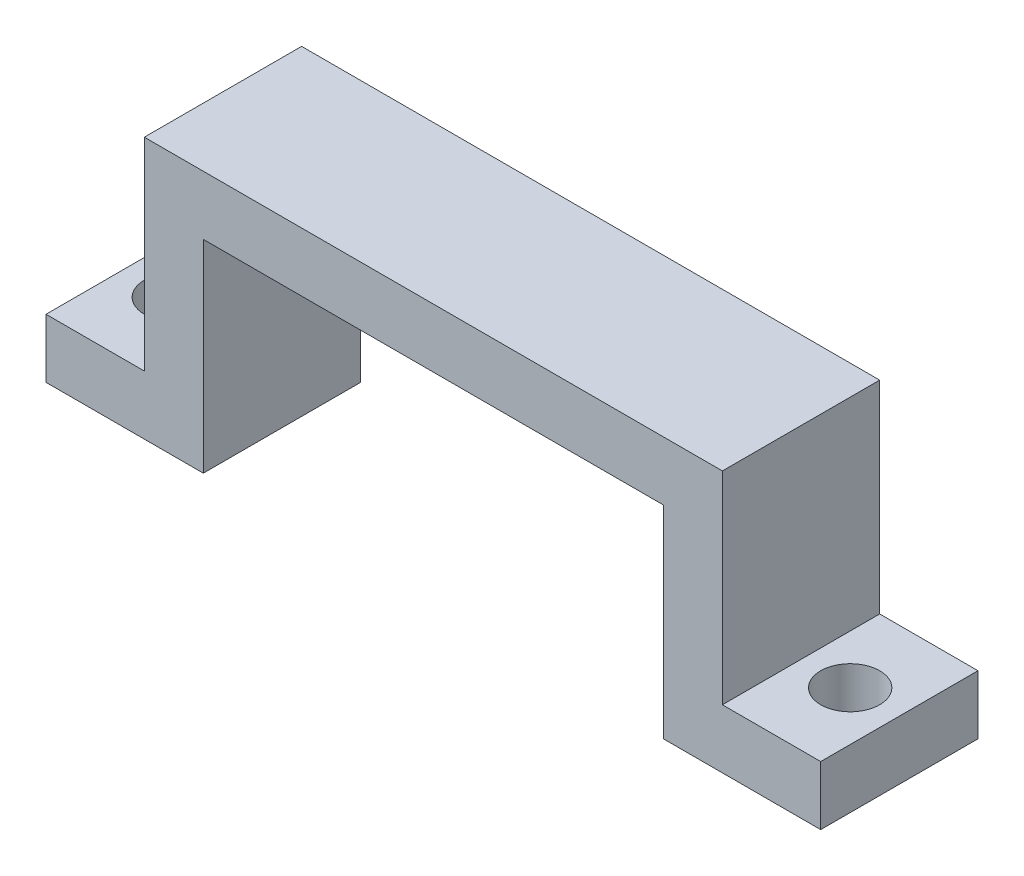
ISO-10303-21;
HEADER;
FILE_DESCRIPTION(('STEP AP214'),'2;1');
FILE_NAME('part.step','',(''),(''),'','','');
FILE_SCHEMA(('AUTOMOTIVE_DESIGN { 1 0 10303 214 1 1 1 1 }'));
ENDSEC;
DATA;
#1=APPLICATION_CONTEXT('core data for automotive mechanical design processes');
#2=APPLICATION_PROTOCOL_DEFINITION('international standard','automotive_design',2000,#1);
#3=PRODUCT_CONTEXT('',#1,'mechanical');
#4=PRODUCT('Part','Part','',(#3));
#5=PRODUCT_RELATED_PRODUCT_CATEGORY('part','',(#4));
#6=PRODUCT_DEFINITION_FORMATION('','',#4);
#7=PRODUCT_DEFINITION_CONTEXT('part definition',#1,'design');
#8=PRODUCT_DEFINITION('design','',#6,#7);
#9=PRODUCT_DEFINITION_SHAPE('','',#8);
#10=(LENGTH_UNIT() NAMED_UNIT(*) SI_UNIT(.MILLI.,.METRE.));
#11=(NAMED_UNIT(*) PLANE_ANGLE_UNIT() SI_UNIT($,.RADIAN.));
#12=(NAMED_UNIT(*) SI_UNIT($,.STERADIAN.) SOLID_ANGLE_UNIT());
#13=UNCERTAINTY_MEASURE_WITH_UNIT(LENGTH_MEASURE(1.E-05),#10,'distance_accuracy_value','');
#14=(GEOMETRIC_REPRESENTATION_CONTEXT(3) GLOBAL_UNCERTAINTY_ASSIGNED_CONTEXT((#13)) GLOBAL_UNIT_ASSIGNED_CONTEXT((#10,
#11,#12)) REPRESENTATION_CONTEXT('',''));
#15=CARTESIAN_POINT('',(0.,0.,0.));
#16=DIRECTION('',(0.,0.,1.));
#17=DIRECTION('',(1.,0.,0.));
#18=AXIS2_PLACEMENT_3D('',#15,#16,#17);
#19=CARTESIAN_POINT('',(-14.7,-13.3,-4.));
#20=DIRECTION('',(-1.,0.,0.));
#21=DIRECTION('',(0.,0.,1.));
#22=AXIS2_PLACEMENT_3D('',#19,#20,#21);
#23=PLANE('',#22);
#24=DIRECTION('',(0.,1.,0.));
#25=VECTOR('',#24,1.);
#26=CARTESIAN_POINT('',(-14.7,-13.3,-4.));
#27=LINE('',#26,#25);
#28=CARTESIAN_POINT('',(-14.7,-10.3,-4.));
#29=VERTEX_POINT('',#28);
#30=CARTESIAN_POINT('',(-14.7,0.,-4.));
#31=VERTEX_POINT('',#30);
#32=EDGE_CURVE('E223',#29,#31,#27,.T.);
#33=ORIENTED_EDGE('',*,*,#32,.F.);
#34=DIRECTION('',(0.,0.,1.));
#35=VECTOR('',#34,1.);
#36=CARTESIAN_POINT('',(-14.7,-10.3,4.));
#37=LINE('',#36,#35);
#38=CARTESIAN_POINT('',(-14.7,-10.3,4.));
#39=VERTEX_POINT('',#38);
#40=EDGE_CURVE('E144',#29,#39,#37,.T.);
#41=ORIENTED_EDGE('',*,*,#40,.T.);
#42=DIRECTION('',(0.,1.,0.));
#43=VECTOR('',#42,1.);
#44=CARTESIAN_POINT('',(-14.7,-13.3,4.));
#45=LINE('',#44,#43);
#46=CARTESIAN_POINT('',(-14.7,0.,4.));
#47=VERTEX_POINT('',#46);
#48=EDGE_CURVE('E44',#39,#47,#45,.T.);
#49=ORIENTED_EDGE('',*,*,#48,.T.);
#50=DIRECTION('',(0.,0.,1.));
#51=VECTOR('',#50,1.);
#52=CARTESIAN_POINT('',(-14.7,0.,-4.));
#53=LINE('',#52,#51);
#54=EDGE_CURVE('E217',#31,#47,#53,.T.);
#55=ORIENTED_EDGE('',*,*,#54,.F.);
#56=EDGE_LOOP('',(#33,#41,#49,#55));
#57=FACE_BOUND('',#56,.T.);
#58=ADVANCED_FACE('F35',(#57),#23,.T.);
#59=CARTESIAN_POINT('',(0.,-13.3,0.));
#60=DIRECTION('',(0.,1.,0.));
#61=DIRECTION('',(0.,0.,1.));
#62=AXIS2_PLACEMENT_3D('',#59,#60,#61);
#63=PLANE('',#62);
#64=CARTESIAN_POINT('',(-17.2,-13.3,0.));
#65=DIRECTION('',(0.,1.,0.));
#66=DIRECTION('',(0.,0.,1.));
#67=AXIS2_PLACEMENT_3D('',#64,#65,#66);
#68=CIRCLE('',#67,1.5);
#69=CARTESIAN_POINT('',(-17.2,-13.3,1.5));
#70=VERTEX_POINT('',#69);
#71=EDGE_CURVE('E422',#70,#70,#68,.T.);
#72=ORIENTED_EDGE('',*,*,#71,.T.);
#73=EDGE_LOOP('',(#72));
#74=FACE_BOUND('',#73,.T.);
#75=DIRECTION('',(-1.,0.,0.));
#76=VECTOR('',#75,1.);
#77=CARTESIAN_POINT('',(-14.7,-13.3,-4.));
#78=LINE('',#77,#76);
#79=CARTESIAN_POINT('',(-11.7,-13.3,-4.));
#80=VERTEX_POINT('',#79);
#81=CARTESIAN_POINT('',(-19.7,-13.3,-4.));
#82=VERTEX_POINT('',#81);
#83=EDGE_CURVE('E209',#80,#82,#78,.T.);
#84=ORIENTED_EDGE('',*,*,#83,.F.);
#85=DIRECTION('',(0.,0.,1.));
#86=VECTOR('',#85,1.);
#87=CARTESIAN_POINT('',(-11.7,-13.3,-4.001));
#88=LINE('',#87,#86);
#89=CARTESIAN_POINT('',(-11.7,-13.3,4.));
#90=VERTEX_POINT('',#89);
#91=EDGE_CURVE('E195',#80,#90,#88,.T.);
#92=ORIENTED_EDGE('',*,*,#91,.T.);
#93=DIRECTION('',(1.,0.,0.));
#94=VECTOR('',#93,1.);
#95=CARTESIAN_POINT('',(-14.7,-13.3,4.));
#96=LINE('',#95,#94);
#97=CARTESIAN_POINT('',(-19.7,-13.3,4.));
#98=VERTEX_POINT('',#97);
#99=EDGE_CURVE('E210',#98,#90,#96,.T.);
#100=ORIENTED_EDGE('',*,*,#99,.F.);
#101=DIRECTION('',(0.,0.,-1.));
#102=VECTOR('',#101,1.);
#103=CARTESIAN_POINT('',(-19.7,-13.3,4.));
#104=LINE('',#103,#102);
#105=EDGE_CURVE('E143',#98,#82,#104,.T.);
#106=ORIENTED_EDGE('',*,*,#105,.T.);
#107=EDGE_LOOP('',(#84,#92,#100,#106));
#108=FACE_BOUND('',#107,.T.);
#109=ADVANCED_FACE('F257',(#74,#108),#63,.F.);
#110=CARTESIAN_POINT('',(14.7,-13.3,-4.));
#111=DIRECTION('',(1.,0.,0.));
#112=DIRECTION('',(0.,0.,-1.));
#113=AXIS2_PLACEMENT_3D('',#110,#111,#112);
#114=PLANE('',#113);
#115=DIRECTION('',(0.,0.,1.));
#116=VECTOR('',#115,1.);
#117=CARTESIAN_POINT('',(14.7,-10.3,4.));
#118=LINE('',#117,#116);
#119=CARTESIAN_POINT('',(14.7,-10.3,-4.));
#120=VERTEX_POINT('',#119);
#121=CARTESIAN_POINT('',(14.7,-10.3,4.));
#122=VERTEX_POINT('',#121);
#123=EDGE_CURVE('E60',#120,#122,#118,.T.);
#124=ORIENTED_EDGE('',*,*,#123,.F.);
#125=DIRECTION('',(0.,1.,0.));
#126=VECTOR('',#125,1.);
#127=CARTESIAN_POINT('',(14.7,-13.3,-4.));
#128=LINE('',#127,#126);
#129=CARTESIAN_POINT('',(14.7,0.,-4.));
#130=VERTEX_POINT('',#129);
#131=EDGE_CURVE('E39',#120,#130,#128,.T.);
#132=ORIENTED_EDGE('',*,*,#131,.T.);
#133=DIRECTION('',(0.,0.,-1.));
#134=VECTOR('',#133,1.);
#135=CARTESIAN_POINT('',(14.7,0.,-4.));
#136=LINE('',#135,#134);
#137=CARTESIAN_POINT('',(14.7,0.,4.));
#138=VERTEX_POINT('',#137);
#139=EDGE_CURVE('E198',#138,#130,#136,.T.);
#140=ORIENTED_EDGE('',*,*,#139,.F.);
#141=DIRECTION('',(0.,1.,0.));
#142=VECTOR('',#141,1.);
#143=CARTESIAN_POINT('',(14.7,-13.3,4.));
#144=LINE('',#143,#142);
#145=EDGE_CURVE('E11',#122,#138,#144,.T.);
#146=ORIENTED_EDGE('',*,*,#145,.F.);
#147=EDGE_LOOP('',(#124,#132,#140,#146));
#148=FACE_BOUND('',#147,.T.);
#149=ADVANCED_FACE('F37',(#148),#114,.T.);
#150=CARTESIAN_POINT('',(-14.7,-13.3,4.));
#151=DIRECTION('',(0.,0.,1.));
#152=DIRECTION('',(1.,0.,0.));
#153=AXIS2_PLACEMENT_3D('',#150,#151,#152);
#154=PLANE('',#153);
#155=DIRECTION('',(0.,-1.,0.));
#156=VECTOR('',#155,1.);
#157=CARTESIAN_POINT('',(-11.7,-13.3,4.));
#158=LINE('',#157,#156);
#159=CARTESIAN_POINT('',(-11.7,-3.,4.));
#160=VERTEX_POINT('',#159);
#161=EDGE_CURVE('E187',#160,#90,#158,.T.);
#162=ORIENTED_EDGE('',*,*,#161,.F.);
#163=DIRECTION('',(-1.,0.,0.));
#164=VECTOR('',#163,1.);
#165=CARTESIAN_POINT('',(-11.7,-3.,4.));
#166=LINE('',#165,#164);
#167=CARTESIAN_POINT('',(11.7,-3.,4.));
#168=VERTEX_POINT('',#167);
#169=EDGE_CURVE('E192',#168,#160,#166,.T.);
#170=ORIENTED_EDGE('',*,*,#169,.F.);
#171=DIRECTION('',(0.,1.,0.));
#172=VECTOR('',#171,1.);
#173=CARTESIAN_POINT('',(11.7,-13.3,4.));
#174=LINE('',#173,#172);
#175=CARTESIAN_POINT('',(11.7,-13.3,4.));
#176=VERTEX_POINT('',#175);
#177=EDGE_CURVE('E189',#176,#168,#174,.T.);
#178=ORIENTED_EDGE('',*,*,#177,.F.);
#179=CARTESIAN_POINT('',(19.7,-13.3,4.));
#180=VERTEX_POINT('',#179);
#181=EDGE_CURVE('E208',#176,#180,#96,.T.);
#182=ORIENTED_EDGE('',*,*,#181,.T.);
#183=DIRECTION('',(0.,-1.,0.));
#184=VECTOR('',#183,1.);
#185=CARTESIAN_POINT('',(19.7,-13.3,4.));
#186=LINE('',#185,#184);
#187=CARTESIAN_POINT('',(19.7,-10.3,4.));
#188=VERTEX_POINT('',#187);
#189=EDGE_CURVE('E161',#188,#180,#186,.T.);
#190=ORIENTED_EDGE('',*,*,#189,.F.);
#191=DIRECTION('',(-1.,0.,0.));
#192=VECTOR('',#191,1.);
#193=CARTESIAN_POINT('',(19.7,-10.3,4.));
#194=LINE('',#193,#192);
#195=EDGE_CURVE('E171',#188,#122,#194,.T.);
#196=ORIENTED_EDGE('',*,*,#195,.T.);
#197=ORIENTED_EDGE('',*,*,#145,.T.);
#198=DIRECTION('',(1.,0.,0.));
#199=VECTOR('',#198,1.);
#200=CARTESIAN_POINT('',(-14.7,0.,4.));
#201=LINE('',#200,#199);
#202=EDGE_CURVE('E220',#47,#138,#201,.T.);
#203=ORIENTED_EDGE('',*,*,#202,.F.);
#204=ORIENTED_EDGE('',*,*,#48,.F.);
#205=DIRECTION('',(1.,0.,0.));
#206=VECTOR('',#205,1.);
#207=CARTESIAN_POINT('',(-19.7,-10.3,4.));
#208=LINE('',#207,#206);
#209=CARTESIAN_POINT('',(-19.7,-10.3,4.));
#210=VERTEX_POINT('',#209);
#211=EDGE_CURVE('E52',#210,#39,#208,.T.);
#212=ORIENTED_EDGE('',*,*,#211,.F.);
#213=DIRECTION('',(0.,-1.,0.));
#214=VECTOR('',#213,1.);
#215=CARTESIAN_POINT('',(-19.7,-13.3,4.));
#216=LINE('',#215,#214);
#217=EDGE_CURVE('E130',#210,#98,#216,.T.);
#218=ORIENTED_EDGE('',*,*,#217,.T.);
#219=ORIENTED_EDGE('',*,*,#99,.T.);
#220=EDGE_LOOP('',(#162,#170,#178,#182,#190,#196,#197,#203,#204,#212,#218,#219));
#221=FACE_BOUND('',#220,.T.);
#222=ADVANCED_FACE('F128',(#221),#154,.T.);
#223=CARTESIAN_POINT('',(-14.7,-13.3,-4.));
#224=DIRECTION('',(0.,0.,-1.));
#225=DIRECTION('',(-1.,0.,0.));
#226=AXIS2_PLACEMENT_3D('',#223,#224,#225);
#227=PLANE('',#226);
#228=DIRECTION('',(0.,-1.,0.));
#229=VECTOR('',#228,1.);
#230=CARTESIAN_POINT('',(-11.7,-13.3,-4.));
#231=LINE('',#230,#229);
#232=CARTESIAN_POINT('',(-11.7,-3.,-4.));
#233=VERTEX_POINT('',#232);
#234=EDGE_CURVE('E184',#233,#80,#231,.T.);
#235=ORIENTED_EDGE('',*,*,#234,.T.);
#236=ORIENTED_EDGE('',*,*,#83,.T.);
#237=DIRECTION('',(0.,1.,0.));
#238=VECTOR('',#237,1.);
#239=CARTESIAN_POINT('',(-19.7,-13.3,-4.));
#240=LINE('',#239,#238);
#241=CARTESIAN_POINT('',(-19.7,-10.3,-4.));
#242=VERTEX_POINT('',#241);
#243=EDGE_CURVE('E147',#82,#242,#240,.T.);
#244=ORIENTED_EDGE('',*,*,#243,.T.);
#245=DIRECTION('',(1.,0.,0.));
#246=VECTOR('',#245,1.);
#247=CARTESIAN_POINT('',(-19.7,-10.3,-4.));
#248=LINE('',#247,#246);
#249=EDGE_CURVE('E134',#242,#29,#248,.T.);
#250=ORIENTED_EDGE('',*,*,#249,.T.);
#251=ORIENTED_EDGE('',*,*,#32,.T.);
#252=DIRECTION('',(-1.,0.,0.));
#253=VECTOR('',#252,1.);
#254=CARTESIAN_POINT('',(-14.7,0.,-4.));
#255=LINE('',#254,#253);
#256=EDGE_CURVE('E214',#130,#31,#255,.T.);
#257=ORIENTED_EDGE('',*,*,#256,.F.);
#258=ORIENTED_EDGE('',*,*,#131,.F.);
#259=DIRECTION('',(-1.,0.,0.));
#260=VECTOR('',#259,1.);
#261=CARTESIAN_POINT('',(19.7,-10.3,-4.));
#262=LINE('',#261,#260);
#263=CARTESIAN_POINT('',(19.7,-10.3,-4.));
#264=VERTEX_POINT('',#263);
#265=EDGE_CURVE('E175',#264,#120,#262,.T.);
#266=ORIENTED_EDGE('',*,*,#265,.F.);
#267=DIRECTION('',(0.,1.,0.));
#268=VECTOR('',#267,1.);
#269=CARTESIAN_POINT('',(19.7,-13.3,-4.));
#270=LINE('',#269,#268);
#271=CARTESIAN_POINT('',(19.7,-13.3,-4.));
#272=VERTEX_POINT('',#271);
#273=EDGE_CURVE('E167',#272,#264,#270,.T.);
#274=ORIENTED_EDGE('',*,*,#273,.F.);
#275=CARTESIAN_POINT('',(11.7,-13.3,-4.));
#276=VERTEX_POINT('',#275);
#277=EDGE_CURVE('E205',#272,#276,#78,.T.);
#278=ORIENTED_EDGE('',*,*,#277,.T.);
#279=DIRECTION('',(0.,1.,0.));
#280=VECTOR('',#279,1.);
#281=CARTESIAN_POINT('',(11.7,-13.3,-4.));
#282=LINE('',#281,#280);
#283=CARTESIAN_POINT('',(11.7,-3.,-4.));
#284=VERTEX_POINT('',#283);
#285=EDGE_CURVE('E178',#276,#284,#282,.T.);
#286=ORIENTED_EDGE('',*,*,#285,.T.);
#287=DIRECTION('',(-1.,0.,0.));
#288=VECTOR('',#287,1.);
#289=CARTESIAN_POINT('',(-11.7,-3.,-4.));
#290=LINE('',#289,#288);
#291=EDGE_CURVE('E181',#284,#233,#290,.T.);
#292=ORIENTED_EDGE('',*,*,#291,.T.);
#293=EDGE_LOOP('',(#235,#236,#244,#250,#251,#257,#258,#266,#274,#278,#286,#292));
#294=FACE_BOUND('',#293,.T.);
#295=ADVANCED_FACE('F230',(#294),#227,.T.);
#296=CARTESIAN_POINT('',(17.2,-13.3,0.));
#297=DIRECTION('',(0.,1.,0.));
#298=DIRECTION('',(0.,0.,1.));
#299=AXIS2_PLACEMENT_3D('',#296,#297,#298);
#300=CIRCLE('',#299,1.5);
#301=CARTESIAN_POINT('',(17.2,-13.3,1.5));
#302=VERTEX_POINT('',#301);
#303=EDGE_CURVE('E158',#302,#302,#300,.F.);
#304=ORIENTED_EDGE('',*,*,#303,.F.);
#305=EDGE_LOOP('',(#304));
#306=FACE_BOUND('',#305,.T.);
#307=ORIENTED_EDGE('',*,*,#181,.F.);
#308=DIRECTION('',(0.,0.,1.));
#309=VECTOR('',#308,1.);
#310=CARTESIAN_POINT('',(11.7,-13.3,-4.001));
#311=LINE('',#310,#309);
#312=EDGE_CURVE('E201',#276,#176,#311,.T.);
#313=ORIENTED_EDGE('',*,*,#312,.F.);
#314=ORIENTED_EDGE('',*,*,#277,.F.);
#315=DIRECTION('',(0.,0.,-1.));
#316=VECTOR('',#315,1.);
#317=CARTESIAN_POINT('',(19.7,-13.3,4.));
#318=LINE('',#317,#316);
#319=EDGE_CURVE('E164',#180,#272,#318,.T.);
#320=ORIENTED_EDGE('',*,*,#319,.F.);
#321=EDGE_LOOP('',(#307,#313,#314,#320));
#322=FACE_BOUND('',#321,.T.);
#323=ADVANCED_FACE('F244',(#306,#322),#63,.F.);
#324=CARTESIAN_POINT('',(0.,0.,0.));
#325=DIRECTION('',(0.,1.,0.));
#326=DIRECTION('',(0.,0.,1.));
#327=AXIS2_PLACEMENT_3D('',#324,#325,#326);
#328=PLANE('',#327);
#329=ORIENTED_EDGE('',*,*,#139,.T.);
#330=ORIENTED_EDGE('',*,*,#256,.T.);
#331=ORIENTED_EDGE('',*,*,#54,.T.);
#332=ORIENTED_EDGE('',*,*,#202,.T.);
#333=EDGE_LOOP('',(#329,#330,#331,#332));
#334=FACE_BOUND('',#333,.T.);
#335=ADVANCED_FACE('F232',(#334),#328,.T.);
#336=CARTESIAN_POINT('',(-11.7,-13.3,-4.001));
#337=DIRECTION('',(-1.,0.,0.));
#338=DIRECTION('',(0.,0.,1.));
#339=AXIS2_PLACEMENT_3D('',#336,#337,#338);
#340=PLANE('',#339);
#341=DIRECTION('',(0.,0.,1.));
#342=VECTOR('',#341,1.);
#343=CARTESIAN_POINT('',(-11.7,-3.,-4.001));
#344=LINE('',#343,#342);
#345=EDGE_CURVE('E196',#233,#160,#344,.T.);
#346=ORIENTED_EDGE('',*,*,#345,.T.);
#347=ORIENTED_EDGE('',*,*,#161,.T.);
#348=ORIENTED_EDGE('',*,*,#91,.F.);
#349=ORIENTED_EDGE('',*,*,#234,.F.);
#350=EDGE_LOOP('',(#346,#347,#348,#349));
#351=FACE_BOUND('',#350,.T.);
#352=ADVANCED_FACE('F258',(#351),#340,.F.);
#353=CARTESIAN_POINT('',(-11.7,-3.,-4.001));
#354=DIRECTION('',(0.,1.,0.));
#355=DIRECTION('',(0.,0.,1.));
#356=AXIS2_PLACEMENT_3D('',#353,#354,#355);
#357=PLANE('',#356);
#358=DIRECTION('',(0.,0.,1.));
#359=VECTOR('',#358,1.);
#360=CARTESIAN_POINT('',(11.7,-3.,-4.001));
#361=LINE('',#360,#359);
#362=EDGE_CURVE('E199',#284,#168,#361,.T.);
#363=ORIENTED_EDGE('',*,*,#362,.T.);
#364=ORIENTED_EDGE('',*,*,#169,.T.);
#365=ORIENTED_EDGE('',*,*,#345,.F.);
#366=ORIENTED_EDGE('',*,*,#291,.F.);
#367=EDGE_LOOP('',(#363,#364,#365,#366));
#368=FACE_BOUND('',#367,.T.);
#369=ADVANCED_FACE('F253',(#368),#357,.F.);
#370=CARTESIAN_POINT('',(11.7,-13.3,-4.001));
#371=DIRECTION('',(1.,0.,0.));
#372=DIRECTION('',(0.,0.,-1.));
#373=AXIS2_PLACEMENT_3D('',#370,#371,#372);
#374=PLANE('',#373);
#375=ORIENTED_EDGE('',*,*,#312,.T.);
#376=ORIENTED_EDGE('',*,*,#177,.T.);
#377=ORIENTED_EDGE('',*,*,#362,.F.);
#378=ORIENTED_EDGE('',*,*,#285,.F.);
#379=EDGE_LOOP('',(#375,#376,#377,#378));
#380=FACE_BOUND('',#379,.T.);
#381=ADVANCED_FACE('F248',(#380),#374,.F.);
#382=CARTESIAN_POINT('',(19.7,-10.3,4.));
#383=DIRECTION('',(0.,-1.,0.));
#384=DIRECTION('',(0.,0.,-1.));
#385=AXIS2_PLACEMENT_3D('',#382,#383,#384);
#386=PLANE('',#385);
#387=CARTESIAN_POINT('',(17.2,-10.3,0.));
#388=DIRECTION('',(0.,1.,0.));
#389=DIRECTION('',(0.,0.,1.));
#390=AXIS2_PLACEMENT_3D('',#387,#388,#389);
#391=CIRCLE('',#390,1.5);
#392=CARTESIAN_POINT('',(17.2,-10.3,1.5));
#393=VERTEX_POINT('',#392);
#394=EDGE_CURVE('E133',#393,#393,#391,.T.);
#395=ORIENTED_EDGE('',*,*,#394,.F.);
#396=EDGE_LOOP('',(#395));
#397=FACE_BOUND('',#396,.T.);
#398=ORIENTED_EDGE('',*,*,#123,.T.);
#399=ORIENTED_EDGE('',*,*,#195,.F.);
#400=DIRECTION('',(0.,0.,1.));
#401=VECTOR('',#400,1.);
#402=CARTESIAN_POINT('',(19.7,-10.3,4.));
#403=LINE('',#402,#401);
#404=EDGE_CURVE('E169',#264,#188,#403,.T.);
#405=ORIENTED_EDGE('',*,*,#404,.F.);
#406=ORIENTED_EDGE('',*,*,#265,.T.);
#407=EDGE_LOOP('',(#398,#399,#405,#406));
#408=FACE_BOUND('',#407,.T.);
#409=ADVANCED_FACE('F236',(#397,#408),#386,.F.);
#410=CARTESIAN_POINT('',(19.7,0.,0.));
#411=DIRECTION('',(-1.,0.,0.));
#412=DIRECTION('',(0.,0.,1.));
#413=AXIS2_PLACEMENT_3D('',#410,#411,#412);
#414=PLANE('',#413);
#415=ORIENTED_EDGE('',*,*,#189,.T.);
#416=ORIENTED_EDGE('',*,*,#319,.T.);
#417=ORIENTED_EDGE('',*,*,#273,.T.);
#418=ORIENTED_EDGE('',*,*,#404,.T.);
#419=EDGE_LOOP('',(#415,#416,#417,#418));
#420=FACE_BOUND('',#419,.T.);
#421=ADVANCED_FACE('F240',(#420),#414,.F.);
#422=CARTESIAN_POINT('',(17.2,-13.301,0.));
#423=DIRECTION('',(0.,1.,0.));
#424=DIRECTION('',(0.,0.,1.));
#425=AXIS2_PLACEMENT_3D('',#422,#423,#424);
#426=CYLINDRICAL_SURFACE('',#425,1.5);
#427=CARTESIAN_POINT('',(17.2,-10.3,1.5));
#428=CARTESIAN_POINT('',(17.2,-10.33125,1.5));
#429=CARTESIAN_POINT('',(17.2,-10.3625,1.5));
#430=CARTESIAN_POINT('',(17.2,-10.425,1.5));
#431=CARTESIAN_POINT('',(17.2,-10.45625,1.5));
#432=CARTESIAN_POINT('',(17.2,-10.51875,1.5));
#433=CARTESIAN_POINT('',(17.2,-10.55,1.5));
#434=CARTESIAN_POINT('',(17.2,-10.6125,1.5));
#435=CARTESIAN_POINT('',(17.2,-10.64375,1.5));
#436=CARTESIAN_POINT('',(17.2,-10.70625,1.5));
#437=CARTESIAN_POINT('',(17.2,-10.7375,1.5));
#438=CARTESIAN_POINT('',(17.2,-10.8,1.5));
#439=CARTESIAN_POINT('',(17.2,-10.83125,1.5));
#440=CARTESIAN_POINT('',(17.2,-10.89375,1.5));
#441=CARTESIAN_POINT('',(17.2,-10.925,1.5));
#442=CARTESIAN_POINT('',(17.2,-10.9875,1.5));
#443=CARTESIAN_POINT('',(17.2,-11.01875,1.5));
#444=CARTESIAN_POINT('',(17.2,-11.08125,1.5));
#445=CARTESIAN_POINT('',(17.2,-11.1125,1.5));
#446=CARTESIAN_POINT('',(17.2,-11.175,1.5));
#447=CARTESIAN_POINT('',(17.2,-11.20625,1.5));
#448=CARTESIAN_POINT('',(17.2,-11.26875,1.5));
#449=CARTESIAN_POINT('',(17.2,-11.3,1.5));
#450=CARTESIAN_POINT('',(17.2,-11.3625,1.5));
#451=CARTESIAN_POINT('',(17.2,-11.39375,1.5));
#452=CARTESIAN_POINT('',(17.2,-11.45625,1.5));
#453=CARTESIAN_POINT('',(17.2,-11.4875,1.5));
#454=CARTESIAN_POINT('',(17.2,-11.55,1.5));
#455=CARTESIAN_POINT('',(17.2,-11.58125,1.5));
#456=CARTESIAN_POINT('',(17.2,-11.64375,1.5));
#457=CARTESIAN_POINT('',(17.2,-11.675,1.5));
#458=CARTESIAN_POINT('',(17.2,-11.7375,1.5));
#459=CARTESIAN_POINT('',(17.2,-11.76875,1.5));
#460=CARTESIAN_POINT('',(17.2,-11.83125,1.5));
#461=CARTESIAN_POINT('',(17.2,-11.8625,1.5));
#462=CARTESIAN_POINT('',(17.2,-11.925,1.5));
#463=CARTESIAN_POINT('',(17.2,-11.95625,1.5));
#464=CARTESIAN_POINT('',(17.2,-12.01875,1.5));
#465=CARTESIAN_POINT('',(17.2,-12.05,1.5));
#466=CARTESIAN_POINT('',(17.2,-12.1125,1.5));
#467=CARTESIAN_POINT('',(17.2,-12.14375,1.5));
#468=CARTESIAN_POINT('',(17.2,-12.20625,1.5));
#469=CARTESIAN_POINT('',(17.2,-12.2375,1.5));
#470=CARTESIAN_POINT('',(17.2,-12.3,1.5));
#471=CARTESIAN_POINT('',(17.2,-12.33125,1.5));
#472=CARTESIAN_POINT('',(17.2,-12.39375,1.5));
#473=CARTESIAN_POINT('',(17.2,-12.425,1.5));
#474=CARTESIAN_POINT('',(17.2,-12.4875,1.5));
#475=CARTESIAN_POINT('',(17.2,-12.51875,1.5));
#476=CARTESIAN_POINT('',(17.2,-12.58125,1.5));
#477=CARTESIAN_POINT('',(17.2,-12.6125,1.5));
#478=CARTESIAN_POINT('',(17.2,-12.675,1.5));
#479=CARTESIAN_POINT('',(17.2,-12.70625,1.5));
#480=CARTESIAN_POINT('',(17.2,-12.76875,1.5));
#481=CARTESIAN_POINT('',(17.2,-12.8,1.5));
#482=CARTESIAN_POINT('',(17.2,-12.8625,1.5));
#483=CARTESIAN_POINT('',(17.2,-12.89375,1.5));
#484=CARTESIAN_POINT('',(17.2,-12.95625,1.5));
#485=CARTESIAN_POINT('',(17.2,-12.9875,1.5));
#486=CARTESIAN_POINT('',(17.2,-13.05,1.5));
#487=CARTESIAN_POINT('',(17.2,-13.08125,1.5));
#488=CARTESIAN_POINT('',(17.2,-13.14375,1.5));
#489=CARTESIAN_POINT('',(17.2,-13.175,1.5));
#490=CARTESIAN_POINT('',(17.2,-13.2375,1.5));
#491=CARTESIAN_POINT('',(17.2,-13.26875,1.5));
#492=CARTESIAN_POINT('',(17.2,-13.3,1.5));
#493=B_SPLINE_CURVE_WITH_KNOTS('',3,(#427,#428,#429,#430,#431,#432,#433,#434,#435,#436,#437,
#438,#439,#440,#441,#442,#443,#444,#445,#446,#447,#448,#449,#450,#451,#452,#453,#454,#455,#456,
#457,#458,#459,#460,#461,#462,#463,#464,#465,#466,#467,#468,#469,#470,#471,#472,#473,#474,#475,
#476,#477,#478,#479,#480,#481,#482,#483,#484,#485,#486,#487,#488,#489,#490,#491,#492),
.UNSPECIFIED.,.F.,.F.,(4,2,2,2,2,2,2,2,2,2,2,2,2,2,2,2,2,2,2,2,2,2,2,2,2,2,2,2,2,2,2,2,4),(0.,
0.0937500000000001,0.1875,0.28125,0.375,0.468749999999999,0.562499999999999,0.656249999999999,
0.749999999999999,0.843749999999999,0.937499999999999,1.03125,1.125,1.21875,1.3125,1.40625,1.5,
1.59375,1.6875,1.78125,1.875,1.96875,2.0625,2.15625,2.25,2.34375,2.4375,2.53125,2.625,2.71875,
2.8125,2.90625,3.),.UNSPECIFIED.);
#494=EDGE_CURVE('BSEAM316',#393,#302,#493,.T.);
#495=ORIENTED_EDGE('',*,*,#394,.T.);
#496=ORIENTED_EDGE('',*,*,#303,.T.);
#497=ORIENTED_EDGE('',*,*,#494,.T.);
#498=ORIENTED_EDGE('',*,*,#494,.F.);
#499=EDGE_LOOP('',(#495,#497,#496,#498));
#500=FACE_BOUND('',#499,.T.);
#501=ADVANCED_FACE('F316',(#500),#426,.F.);
#502=CARTESIAN_POINT('',(-19.7,-10.3,4.));
#503=DIRECTION('',(0.,1.,0.));
#504=DIRECTION('',(0.,0.,1.));
#505=AXIS2_PLACEMENT_3D('',#502,#503,#504);
#506=PLANE('',#505);
#507=CARTESIAN_POINT('',(-17.2,-10.3,0.));
#508=DIRECTION('',(0.,-1.,0.));
#509=DIRECTION('',(0.,0.,1.));
#510=AXIS2_PLACEMENT_3D('',#507,#508,#509);
#511=CIRCLE('',#510,1.5);
#512=CARTESIAN_POINT('',(-17.2,-10.3,1.5));
#513=VERTEX_POINT('',#512);
#514=EDGE_CURVE('E154',#513,#513,#511,.T.);
#515=ORIENTED_EDGE('',*,*,#514,.T.);
#516=EDGE_LOOP('',(#515));
#517=FACE_BOUND('',#516,.T.);
#518=ORIENTED_EDGE('',*,*,#40,.F.);
#519=ORIENTED_EDGE('',*,*,#249,.F.);
#520=DIRECTION('',(0.,0.,1.));
#521=VECTOR('',#520,1.);
#522=CARTESIAN_POINT('',(-19.7,-10.3,4.));
#523=LINE('',#522,#521);
#524=EDGE_CURVE('E140',#242,#210,#523,.T.);
#525=ORIENTED_EDGE('',*,*,#524,.T.);
#526=ORIENTED_EDGE('',*,*,#211,.T.);
#527=EDGE_LOOP('',(#518,#519,#525,#526));
#528=FACE_BOUND('',#527,.T.);
#529=ADVANCED_FACE('F146',(#517,#528),#506,.T.);
#530=CARTESIAN_POINT('',(-19.7,0.,0.));
#531=DIRECTION('',(1.,0.,0.));
#532=DIRECTION('',(0.,0.,1.));
#533=AXIS2_PLACEMENT_3D('',#530,#531,#532);
#534=PLANE('',#533);
#535=ORIENTED_EDGE('',*,*,#217,.F.);
#536=ORIENTED_EDGE('',*,*,#524,.F.);
#537=ORIENTED_EDGE('',*,*,#243,.F.);
#538=ORIENTED_EDGE('',*,*,#105,.F.);
#539=EDGE_LOOP('',(#535,#536,#537,#538));
#540=FACE_BOUND('',#539,.T.);
#541=ADVANCED_FACE('F138',(#540),#534,.F.);
#542=CARTESIAN_POINT('',(-17.2,-13.301,0.));
#543=DIRECTION('',(0.,1.,0.));
#544=DIRECTION('',(0.,0.,1.));
#545=AXIS2_PLACEMENT_3D('',#542,#543,#544);
#546=CYLINDRICAL_SURFACE('',#545,1.5);
#547=CARTESIAN_POINT('',(-17.2,-10.3,1.5));
#548=CARTESIAN_POINT('',(-17.2,-10.33125,1.5));
#549=CARTESIAN_POINT('',(-17.2,-10.3625,1.5));
#550=CARTESIAN_POINT('',(-17.2,-10.425,1.5));
#551=CARTESIAN_POINT('',(-17.2,-10.45625,1.5));
#552=CARTESIAN_POINT('',(-17.2,-10.51875,1.5));
#553=CARTESIAN_POINT('',(-17.2,-10.55,1.5));
#554=CARTESIAN_POINT('',(-17.2,-10.6125,1.5));
#555=CARTESIAN_POINT('',(-17.2,-10.64375,1.5));
#556=CARTESIAN_POINT('',(-17.2,-10.70625,1.5));
#557=CARTESIAN_POINT('',(-17.2,-10.7375,1.5));
#558=CARTESIAN_POINT('',(-17.2,-10.8,1.5));
#559=CARTESIAN_POINT('',(-17.2,-10.83125,1.5));
#560=CARTESIAN_POINT('',(-17.2,-10.89375,1.5));
#561=CARTESIAN_POINT('',(-17.2,-10.925,1.5));
#562=CARTESIAN_POINT('',(-17.2,-10.9875,1.5));
#563=CARTESIAN_POINT('',(-17.2,-11.01875,1.5));
#564=CARTESIAN_POINT('',(-17.2,-11.08125,1.5));
#565=CARTESIAN_POINT('',(-17.2,-11.1125,1.5));
#566=CARTESIAN_POINT('',(-17.2,-11.175,1.5));
#567=CARTESIAN_POINT('',(-17.2,-11.20625,1.5));
#568=CARTESIAN_POINT('',(-17.2,-11.26875,1.5));
#569=CARTESIAN_POINT('',(-17.2,-11.3,1.5));
#570=CARTESIAN_POINT('',(-17.2,-11.3625,1.5));
#571=CARTESIAN_POINT('',(-17.2,-11.39375,1.5));
#572=CARTESIAN_POINT('',(-17.2,-11.45625,1.5));
#573=CARTESIAN_POINT('',(-17.2,-11.4875,1.5));
#574=CARTESIAN_POINT('',(-17.2,-11.55,1.5));
#575=CARTESIAN_POINT('',(-17.2,-11.58125,1.5));
#576=CARTESIAN_POINT('',(-17.2,-11.64375,1.5));
#577=CARTESIAN_POINT('',(-17.2,-11.675,1.5));
#578=CARTESIAN_POINT('',(-17.2,-11.7375,1.5));
#579=CARTESIAN_POINT('',(-17.2,-11.76875,1.5));
#580=CARTESIAN_POINT('',(-17.2,-11.83125,1.5));
#581=CARTESIAN_POINT('',(-17.2,-11.8625,1.5));
#582=CARTESIAN_POINT('',(-17.2,-11.925,1.5));
#583=CARTESIAN_POINT('',(-17.2,-11.95625,1.5));
#584=CARTESIAN_POINT('',(-17.2,-12.01875,1.5));
#585=CARTESIAN_POINT('',(-17.2,-12.05,1.5));
#586=CARTESIAN_POINT('',(-17.2,-12.1125,1.5));
#587=CARTESIAN_POINT('',(-17.2,-12.14375,1.5));
#588=CARTESIAN_POINT('',(-17.2,-12.20625,1.5));
#589=CARTESIAN_POINT('',(-17.2,-12.2375,1.5));
#590=CARTESIAN_POINT('',(-17.2,-12.3,1.5));
#591=CARTESIAN_POINT('',(-17.2,-12.33125,1.5));
#592=CARTESIAN_POINT('',(-17.2,-12.39375,1.5));
#593=CARTESIAN_POINT('',(-17.2,-12.425,1.5));
#594=CARTESIAN_POINT('',(-17.2,-12.4875,1.5));
#595=CARTESIAN_POINT('',(-17.2,-12.51875,1.5));
#596=CARTESIAN_POINT('',(-17.2,-12.58125,1.5));
#597=CARTESIAN_POINT('',(-17.2,-12.6125,1.5));
#598=CARTESIAN_POINT('',(-17.2,-12.675,1.5));
#599=CARTESIAN_POINT('',(-17.2,-12.70625,1.5));
#600=CARTESIAN_POINT('',(-17.2,-12.76875,1.5));
#601=CARTESIAN_POINT('',(-17.2,-12.8,1.5));
#602=CARTESIAN_POINT('',(-17.2,-12.8625,1.5));
#603=CARTESIAN_POINT('',(-17.2,-12.89375,1.5));
#604=CARTESIAN_POINT('',(-17.2,-12.95625,1.5));
#605=CARTESIAN_POINT('',(-17.2,-12.9875,1.5));
#606=CARTESIAN_POINT('',(-17.2,-13.05,1.5));
#607=CARTESIAN_POINT('',(-17.2,-13.08125,1.5));
#608=CARTESIAN_POINT('',(-17.2,-13.14375,1.5));
#609=CARTESIAN_POINT('',(-17.2,-13.175,1.5));
#610=CARTESIAN_POINT('',(-17.2,-13.2375,1.5));
#611=CARTESIAN_POINT('',(-17.2,-13.26875,1.5));
#612=CARTESIAN_POINT('',(-17.2,-13.3,1.5));
#613=B_SPLINE_CURVE_WITH_KNOTS('',3,(#547,#548,#549,#550,#551,#552,#553,#554,#555,#556,#557,
#558,#559,#560,#561,#562,#563,#564,#565,#566,#567,#568,#569,#570,#571,#572,#573,#574,#575,#576,
#577,#578,#579,#580,#581,#582,#583,#584,#585,#586,#587,#588,#589,#590,#591,#592,#593,#594,#595,
#596,#597,#598,#599,#600,#601,#602,#603,#604,#605,#606,#607,#608,#609,#610,#611,#612),
.UNSPECIFIED.,.F.,.F.,(4,2,2,2,2,2,2,2,2,2,2,2,2,2,2,2,2,2,2,2,2,2,2,2,2,2,2,2,2,2,2,2,4),(0.,
0.0937500000000001,0.1875,0.28125,0.375,0.46875,0.5625,0.656250000000001,0.750000000000001,
0.843750000000001,0.937500000000001,1.03125,1.125,1.21875,1.3125,1.40625,1.5,1.59375,1.6875,
1.78125,1.875,1.96875,2.0625,2.15625,2.25,2.34375,2.4375,2.53125,2.625,2.71875,2.8125,2.90625,
3.),.UNSPECIFIED.);
#614=EDGE_CURVE('BSEAM327',#513,#70,#613,.T.);
#615=ORIENTED_EDGE('',*,*,#514,.F.);
#616=ORIENTED_EDGE('',*,*,#71,.F.);
#617=ORIENTED_EDGE('',*,*,#614,.T.);
#618=ORIENTED_EDGE('',*,*,#614,.F.);
#619=EDGE_LOOP('',(#615,#617,#616,#618));
#620=FACE_BOUND('',#619,.T.);
#621=ADVANCED_FACE('F327',(#620),#546,.F.);
#622=CLOSED_SHELL('',(#58,#109,#149,#222,#295,#323,#335,#352,#369,#381,#409,#421,#501,#529,#541,#621));
#623=MANIFOLD_SOLID_BREP('B2',#622);
#624=ADVANCED_BREP_SHAPE_REPRESENTATION('',(#18,#623),#14);
#625=SHAPE_DEFINITION_REPRESENTATION(#9,#624);
ENDSEC;
END-ISO-10303-21;
